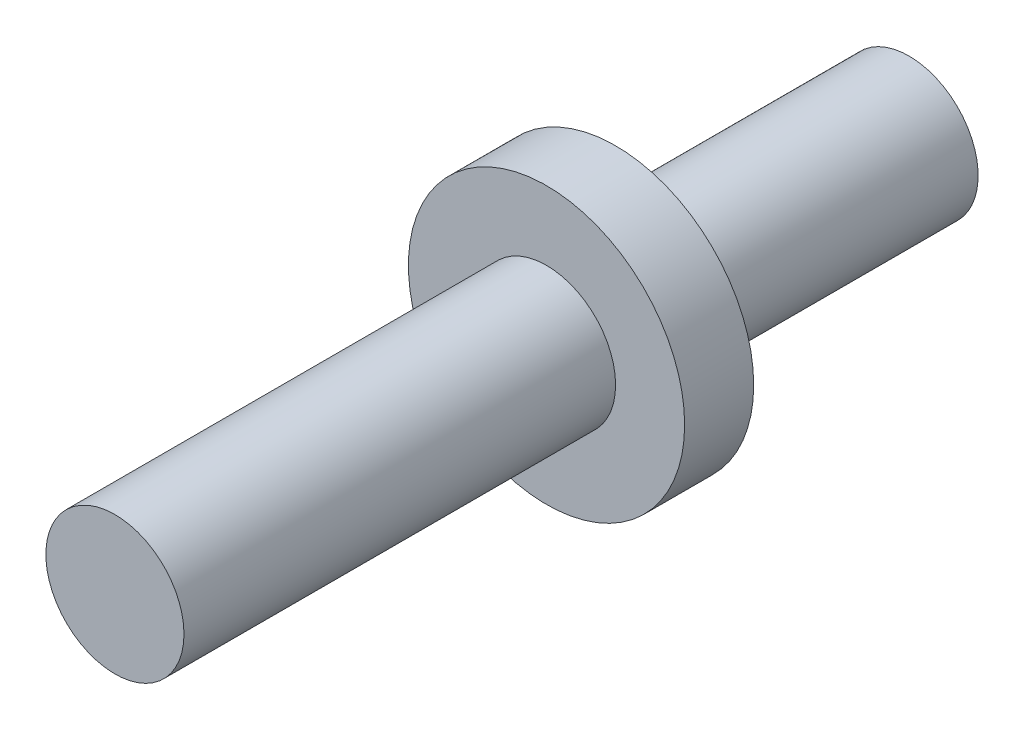
ISO-10303-21;
HEADER;
FILE_DESCRIPTION(('STEP AP214'),'2;1');
FILE_NAME('part.step','',(''),(''),'','','');
FILE_SCHEMA(('AUTOMOTIVE_DESIGN { 1 0 10303 214 1 1 1 1 }'));
ENDSEC;
DATA;
#1=APPLICATION_CONTEXT('core data for automotive mechanical design processes');
#2=APPLICATION_PROTOCOL_DEFINITION('international standard','automotive_design',2000,#1);
#3=PRODUCT_CONTEXT('',#1,'mechanical');
#4=PRODUCT('Part','Part','',(#3));
#5=PRODUCT_RELATED_PRODUCT_CATEGORY('part','',(#4));
#6=PRODUCT_DEFINITION_FORMATION('','',#4);
#7=PRODUCT_DEFINITION_CONTEXT('part definition',#1,'design');
#8=PRODUCT_DEFINITION('design','',#6,#7);
#9=PRODUCT_DEFINITION_SHAPE('','',#8);
#10=(LENGTH_UNIT() NAMED_UNIT(*) SI_UNIT(.MILLI.,.METRE.));
#11=(NAMED_UNIT(*) PLANE_ANGLE_UNIT() SI_UNIT($,.RADIAN.));
#12=(NAMED_UNIT(*) SI_UNIT($,.STERADIAN.) SOLID_ANGLE_UNIT());
#13=UNCERTAINTY_MEASURE_WITH_UNIT(LENGTH_MEASURE(1.E-05),#10,'distance_accuracy_value','');
#14=(GEOMETRIC_REPRESENTATION_CONTEXT(3) GLOBAL_UNCERTAINTY_ASSIGNED_CONTEXT((#13)) GLOBAL_UNIT_ASSIGNED_CONTEXT((#10,
#11,#12)) REPRESENTATION_CONTEXT('',''));
#15=CARTESIAN_POINT('',(0.,0.,0.));
#16=DIRECTION('',(0.,0.,1.));
#17=DIRECTION('',(1.,0.,0.));
#18=AXIS2_PLACEMENT_3D('',#15,#16,#17);
#19=CARTESIAN_POINT('',(0.,0.,0.));
#20=DIRECTION('',(0.,0.,1.));
#21=DIRECTION('',(1.,0.,0.));
#22=AXIS2_PLACEMENT_3D('',#19,#20,#21);
#23=PLANE('',#22);
#24=CARTESIAN_POINT('',(0.,0.,0.));
#25=DIRECTION('',(0.,0.,1.));
#26=DIRECTION('',(1.,0.,0.));
#27=AXIS2_PLACEMENT_3D('',#24,#25,#26);
#28=CIRCLE('',#27,16.);
#29=CARTESIAN_POINT('',(16.,0.,0.));
#30=VERTEX_POINT('',#29);
#31=EDGE_CURVE('E47',#30,#30,#28,.T.);
#32=ORIENTED_EDGE('',*,*,#31,.F.);
#33=EDGE_LOOP('',(#32));
#34=FACE_BOUND('',#33,.T.);
#35=CARTESIAN_POINT('',(0.,0.,0.));
#36=DIRECTION('',(0.,0.,-1.));
#37=DIRECTION('',(-1.,0.,0.));
#38=AXIS2_PLACEMENT_3D('',#35,#36,#37);
#39=CIRCLE('',#38,8.);
#40=CARTESIAN_POINT('',(-8.,0.,0.));
#41=VERTEX_POINT('',#40);
#42=EDGE_CURVE('E10',#41,#41,#39,.T.);
#43=ORIENTED_EDGE('',*,*,#42,.F.);
#44=EDGE_LOOP('',(#43));
#45=FACE_BOUND('',#44,.T.);
#46=ADVANCED_FACE('F27',(#34,#45),#23,.F.);
#47=CARTESIAN_POINT('',(0.,0.,8.));
#48=DIRECTION('',(0.,0.,-1.));
#49=DIRECTION('',(-1.,0.,0.));
#50=AXIS2_PLACEMENT_3D('',#47,#48,#49);
#51=CYLINDRICAL_SURFACE('',#50,16.);
#52=CARTESIAN_POINT('',(0.,0.,8.));
#53=DIRECTION('',(0.,0.,1.));
#54=DIRECTION('',(1.,0.,0.));
#55=AXIS2_PLACEMENT_3D('',#52,#53,#54);
#56=CIRCLE('',#55,16.);
#57=CARTESIAN_POINT('',(16.,0.,8.));
#58=VERTEX_POINT('',#57);
#59=EDGE_CURVE('E31',#58,#58,#56,.T.);
#60=ORIENTED_EDGE('',*,*,#59,.F.);
#61=EDGE_LOOP('',(#60));
#62=FACE_BOUND('',#61,.T.);
#63=ORIENTED_EDGE('',*,*,#31,.T.);
#64=EDGE_LOOP('',(#63));
#65=FACE_BOUND('',#64,.T.);
#66=ADVANCED_FACE('F29',(#62,#65),#51,.T.);
#67=CARTESIAN_POINT('',(0.,0.,8.));
#68=DIRECTION('',(0.,0.,1.));
#69=DIRECTION('',(1.,0.,0.));
#70=AXIS2_PLACEMENT_3D('',#67,#68,#69);
#71=PLANE('',#70);
#72=CARTESIAN_POINT('',(0.,0.,8.));
#73=DIRECTION('',(0.,0.,1.));
#74=DIRECTION('',(1.,0.,0.));
#75=AXIS2_PLACEMENT_3D('',#72,#73,#74);
#76=CIRCLE('',#75,8.);
#77=CARTESIAN_POINT('',(8.,0.,8.));
#78=VERTEX_POINT('',#77);
#79=EDGE_CURVE('E35',#78,#78,#76,.T.);
#80=ORIENTED_EDGE('',*,*,#79,.F.);
#81=EDGE_LOOP('',(#80));
#82=FACE_BOUND('',#81,.T.);
#83=ORIENTED_EDGE('',*,*,#59,.T.);
#84=EDGE_LOOP('',(#83));
#85=FACE_BOUND('',#84,.T.);
#86=ADVANCED_FACE('F54',(#82,#85),#71,.T.);
#87=CARTESIAN_POINT('',(0.,0.,58.));
#88=DIRECTION('',(0.,0.,-1.));
#89=DIRECTION('',(-1.,0.,0.));
#90=AXIS2_PLACEMENT_3D('',#87,#88,#89);
#91=CYLINDRICAL_SURFACE('',#90,8.);
#92=CARTESIAN_POINT('',(0.,0.,58.));
#93=DIRECTION('',(0.,0.,1.));
#94=DIRECTION('',(1.,0.,0.));
#95=AXIS2_PLACEMENT_3D('',#92,#93,#94);
#96=CIRCLE('',#95,8.);
#97=CARTESIAN_POINT('',(8.,0.,58.));
#98=VERTEX_POINT('',#97);
#99=EDGE_CURVE('E44',#98,#98,#96,.T.);
#100=ORIENTED_EDGE('',*,*,#99,.F.);
#101=EDGE_LOOP('',(#100));
#102=FACE_BOUND('',#101,.T.);
#103=ORIENTED_EDGE('',*,*,#79,.T.);
#104=EDGE_LOOP('',(#103));
#105=FACE_BOUND('',#104,.T.);
#106=ADVANCED_FACE('F61',(#102,#105),#91,.T.);
#107=CARTESIAN_POINT('',(0.,0.,58.));
#108=DIRECTION('',(0.,0.,1.));
#109=DIRECTION('',(1.,0.,0.));
#110=AXIS2_PLACEMENT_3D('',#107,#108,#109);
#111=PLANE('',#110);
#112=ORIENTED_EDGE('',*,*,#99,.T.);
#113=EDGE_LOOP('',(#112));
#114=FACE_BOUND('',#113,.T.);
#115=ADVANCED_FACE('F71',(#114),#111,.T.);
#116=CARTESIAN_POINT('',(0.,0.,-34.));
#117=DIRECTION('',(0.,0.,1.));
#118=DIRECTION('',(1.,0.,0.));
#119=AXIS2_PLACEMENT_3D('',#116,#117,#118);
#120=CYLINDRICAL_SURFACE('',#119,8.);
#121=CARTESIAN_POINT('',(0.,0.,-34.));
#122=DIRECTION('',(0.,0.,-1.));
#123=DIRECTION('',(-1.,0.,0.));
#124=AXIS2_PLACEMENT_3D('',#121,#122,#123);
#125=CIRCLE('',#124,8.);
#126=CARTESIAN_POINT('',(-8.,0.,-34.));
#127=VERTEX_POINT('',#126);
#128=EDGE_CURVE('E42',#127,#127,#125,.T.);
#129=ORIENTED_EDGE('',*,*,#128,.F.);
#130=EDGE_LOOP('',(#129));
#131=FACE_BOUND('',#130,.T.);
#132=ORIENTED_EDGE('',*,*,#42,.T.);
#133=EDGE_LOOP('',(#132));
#134=FACE_BOUND('',#133,.T.);
#135=ADVANCED_FACE('F75',(#131,#134),#120,.T.);
#136=CARTESIAN_POINT('',(0.,0.,-34.));
#137=DIRECTION('',(0.,0.,-1.));
#138=DIRECTION('',(-1.,0.,0.));
#139=AXIS2_PLACEMENT_3D('',#136,#137,#138);
#140=PLANE('',#139);
#141=ORIENTED_EDGE('',*,*,#128,.T.);
#142=EDGE_LOOP('',(#141));
#143=FACE_BOUND('',#142,.T.);
#144=ADVANCED_FACE('F79',(#143),#140,.T.);
#145=CLOSED_SHELL('',(#46,#66,#86,#106,#115,#135,#144));
#146=MANIFOLD_SOLID_BREP('B2',#145);
#147=ADVANCED_BREP_SHAPE_REPRESENTATION('',(#18,#146),#14);
#148=SHAPE_DEFINITION_REPRESENTATION(#9,#147);
ENDSEC;
END-ISO-10303-21;
